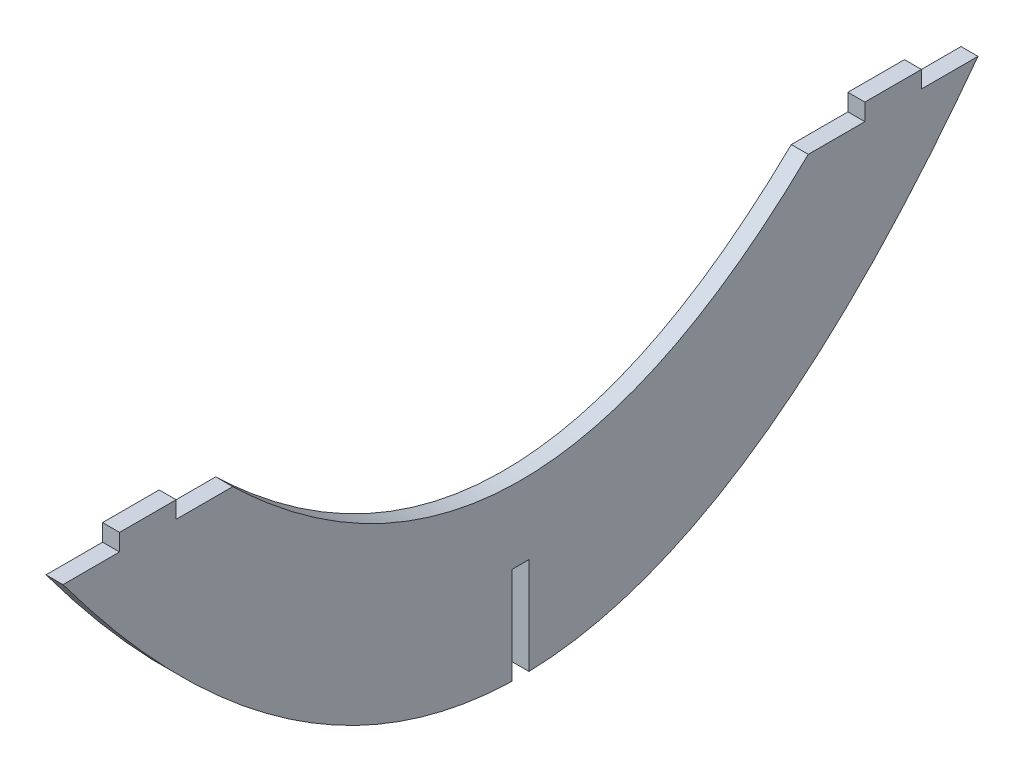
ISO-10303-21;
HEADER;
FILE_DESCRIPTION(('STEP AP214'),'2;1');
FILE_NAME('part.step','',(''),(''),'','','');
FILE_SCHEMA(('AUTOMOTIVE_DESIGN { 1 0 10303 214 1 1 1 1 }'));
ENDSEC;
DATA;
#1=APPLICATION_CONTEXT('core data for automotive mechanical design processes');
#2=APPLICATION_PROTOCOL_DEFINITION('international standard','automotive_design',2000,#1);
#3=PRODUCT_CONTEXT('',#1,'mechanical');
#4=PRODUCT('Part','Part','',(#3));
#5=PRODUCT_RELATED_PRODUCT_CATEGORY('part','',(#4));
#6=PRODUCT_DEFINITION_FORMATION('','',#4);
#7=PRODUCT_DEFINITION_CONTEXT('part definition',#1,'design');
#8=PRODUCT_DEFINITION('design','',#6,#7);
#9=PRODUCT_DEFINITION_SHAPE('','',#8);
#10=(LENGTH_UNIT() NAMED_UNIT(*) SI_UNIT(.MILLI.,.METRE.));
#11=(NAMED_UNIT(*) PLANE_ANGLE_UNIT() SI_UNIT($,.RADIAN.));
#12=(NAMED_UNIT(*) SI_UNIT($,.STERADIAN.) SOLID_ANGLE_UNIT());
#13=UNCERTAINTY_MEASURE_WITH_UNIT(LENGTH_MEASURE(1.E-05),#10,'distance_accuracy_value','');
#14=(GEOMETRIC_REPRESENTATION_CONTEXT(3) GLOBAL_UNCERTAINTY_ASSIGNED_CONTEXT((#13)) GLOBAL_UNIT_ASSIGNED_CONTEXT((#10,
#11,#12)) REPRESENTATION_CONTEXT('',''));
#15=CARTESIAN_POINT('',(0.,0.,0.));
#16=DIRECTION('',(0.,0.,1.));
#17=DIRECTION('',(1.,0.,0.));
#18=AXIS2_PLACEMENT_3D('',#15,#16,#17);
#19=CARTESIAN_POINT('',(3.,119.997819813928,80.8727741201523));
#20=CARTESIAN_POINT('',(3.,10.9954201860998,2.01496805352086E-11));
#21=CARTESIAN_POINT('',(3.,119.997819813872,-80.872774120112));
#22=B_SPLINE_CURVE_WITH_KNOTS('',2,(#19,#20,#21),.UNSPECIFIED.,.F.,.F.,(3,3),
(0.0624050077970689,0.937594992202713),.UNSPECIFIED.);
#23=DIRECTION('',(-1.,0.,0.));
#24=VECTOR('',#23,1.);
#25=SURFACE_OF_LINEAR_EXTRUSION('',#22,#24);
#26=DIRECTION('',(-1.,0.,0.));
#27=VECTOR('',#26,1.);
#28=CARTESIAN_POINT('',(3.,65.5153692500001,1.50000000000244));
#29=LINE('',#28,#27);
#30=CARTESIAN_POINT('',(3.,65.5153692500001,1.50000000000244));
#31=VERTEX_POINT('',#30);
#32=CARTESIAN_POINT('',(0.,65.5153692500001,1.50000000000244));
#33=VERTEX_POINT('',#32);
#34=EDGE_CURVE('E180',#31,#33,#29,.T.);
#35=ORIENTED_EDGE('',*,*,#34,.F.);
#36=CARTESIAN_POINT('',(3.,119.997819813902,80.8727741201333));
#37=VERTEX_POINT('',#36);
#38=EDGE_CURVE('E171',#37,#31,#22,.T.);
#39=ORIENTED_EDGE('',*,*,#38,.F.);
#40=DIRECTION('',(-1.,0.,0.));
#41=VECTOR('',#40,1.);
#42=CARTESIAN_POINT('',(3.,119.997819813902,80.8727741201333));
#43=LINE('',#42,#41);
#44=CARTESIAN_POINT('',(0.,119.997819813902,80.8727741201333));
#45=VERTEX_POINT('',#44);
#46=EDGE_CURVE('E46',#37,#45,#43,.T.);
#47=ORIENTED_EDGE('',*,*,#46,.T.);
#48=CARTESIAN_POINT('',(0.,119.997819813928,80.8727741201523));
#49=CARTESIAN_POINT('',(0.,10.9954201860998,2.01496805352086E-11));
#50=CARTESIAN_POINT('',(0.,119.997819813872,-80.872774120112));
#51=B_SPLINE_CURVE_WITH_KNOTS('',2,(#48,#49,#50),.UNSPECIFIED.,.F.,.F.,(3,3),
(0.0624050077970689,0.937594992202713),.UNSPECIFIED.);
#52=EDGE_CURVE('E291',#45,#33,#51,.T.);
#53=ORIENTED_EDGE('',*,*,#52,.T.);
#54=EDGE_LOOP('',(#35,#39,#47,#53));
#55=FACE_BOUND('',#54,.T.);
#56=ADVANCED_FACE('F37',(#55),#25,.F.);
#57=CARTESIAN_POINT('',(3.,95.49662,2.76688394418301E-11));
#58=DIRECTION('',(-1.,0.,0.));
#59=DIRECTION('',(0.,0.,1.));
#60=AXIS2_PLACEMENT_3D('',#57,#58,#59);
#61=PLANE('',#60);
#62=DIRECTION('',(0.,-1.,0.));
#63=VECTOR('',#62,1.);
#64=CARTESIAN_POINT('',(3.,0.,1.50000000000245));
#65=LINE('',#64,#63);
#66=CARTESIAN_POINT('',(3.,82.6427098007151,1.50000000000244));
#67=VERTEX_POINT('',#66);
#68=EDGE_CURVE('E163',#67,#31,#65,.T.);
#69=ORIENTED_EDGE('',*,*,#68,.F.);
#70=DIRECTION('',(0.,0.,1.));
#71=VECTOR('',#70,1.);
#72=CARTESIAN_POINT('',(3.,82.6427098007151,0.));
#73=LINE('',#72,#71);
#74=CARTESIAN_POINT('',(3.,82.6427098007151,-1.49999999999756));
#75=VERTEX_POINT('',#74);
#76=EDGE_CURVE('E152',#75,#67,#73,.T.);
#77=ORIENTED_EDGE('',*,*,#76,.F.);
#78=DIRECTION('',(0.,-1.,0.));
#79=VECTOR('',#78,1.);
#80=CARTESIAN_POINT('',(3.,0.,-1.49999999999756));
#81=LINE('',#80,#79);
#82=CARTESIAN_POINT('',(3.,65.5153692499999,-1.49999999999756));
#83=VERTEX_POINT('',#82);
#84=EDGE_CURVE('E162',#75,#83,#81,.T.);
#85=ORIENTED_EDGE('',*,*,#84,.T.);
#86=CARTESIAN_POINT('',(3.,119.997819813872,-80.872774120112));
#87=VERTEX_POINT('',#86);
#88=EDGE_CURVE('E251',#83,#87,#22,.T.);
#89=ORIENTED_EDGE('',*,*,#88,.T.);
#90=DIRECTION('',(0.,0.,1.));
#91=VECTOR('',#90,1.);
#92=CARTESIAN_POINT('',(3.,119.997819813902,-50.8705095800965));
#93=LINE('',#92,#91);
#94=CARTESIAN_POINT('',(3.,119.997819813902,-70.8716418501043));
#95=VERTEX_POINT('',#94);
#96=EDGE_CURVE('E257',#87,#95,#93,.T.);
#97=ORIENTED_EDGE('',*,*,#96,.T.);
#98=DIRECTION('',(0.,-1.,0.));
#99=VECTOR('',#98,1.);
#100=CARTESIAN_POINT('',(3.,122.997819813902,-70.8716418501043));
#101=LINE('',#100,#99);
#102=CARTESIAN_POINT('',(3.,122.997819813902,-70.8716418501043));
#103=VERTEX_POINT('',#102);
#104=EDGE_CURVE('E223',#103,#95,#101,.T.);
#105=ORIENTED_EDGE('',*,*,#104,.F.);
#106=DIRECTION('',(0.,0.,-1.));
#107=VECTOR('',#106,1.);
#108=CARTESIAN_POINT('',(3.,122.997819813902,0.));
#109=LINE('',#108,#107);
#110=CARTESIAN_POINT('',(3.,122.997819813902,-60.8716418501042));
#111=VERTEX_POINT('',#110);
#112=EDGE_CURVE('E221',#111,#103,#109,.T.);
#113=ORIENTED_EDGE('',*,*,#112,.F.);
#114=DIRECTION('',(0.,-1.,0.));
#115=VECTOR('',#114,1.);
#116=CARTESIAN_POINT('',(3.,122.997819813902,-60.8716418501042));
#117=LINE('',#116,#115);
#118=CARTESIAN_POINT('',(3.,119.997819813902,-60.8716418501042));
#119=VERTEX_POINT('',#118);
#120=EDGE_CURVE('E229',#111,#119,#117,.T.);
#121=ORIENTED_EDGE('',*,*,#120,.T.);
#122=CARTESIAN_POINT('',(3.,119.997819813902,-50.8705095800965));
#123=VERTEX_POINT('',#122);
#124=EDGE_CURVE('E256',#119,#123,#93,.T.);
#125=ORIENTED_EDGE('',*,*,#124,.T.);
#126=CARTESIAN_POINT('',(3.,119.997819813882,-50.8705095800754));
#127=CARTESIAN_POINT('',(3.,70.9954201860914,2.7670574165306E-11));
#128=CARTESIAN_POINT('',(3.,119.997819813935,50.8705095801307));
#129=B_SPLINE_CURVE_WITH_KNOTS('',2,(#126,#127,#128),.UNSPECIFIED.,.F.,.F.,(3,3),
(0.223373808690402,0.776626191309298),.UNSPECIFIED.);
#130=CARTESIAN_POINT('',(3.,119.997819813902,50.8705095800965));
#131=VERTEX_POINT('',#130);
#132=EDGE_CURVE('E238',#123,#131,#129,.T.);
#133=ORIENTED_EDGE('',*,*,#132,.T.);
#134=DIRECTION('',(0.,0.,1.));
#135=VECTOR('',#134,1.);
#136=CARTESIAN_POINT('',(3.,119.997819813902,80.8727741201333));
#137=LINE('',#136,#135);
#138=CARTESIAN_POINT('',(3.,119.997819813902,60.8716418501148));
#139=VERTEX_POINT('',#138);
#140=EDGE_CURVE('E245',#131,#139,#137,.T.);
#141=ORIENTED_EDGE('',*,*,#140,.T.);
#142=DIRECTION('',(0.,-1.,0.));
#143=VECTOR('',#142,1.);
#144=CARTESIAN_POINT('',(3.,122.997819813902,60.8716418501148));
#145=LINE('',#144,#143);
#146=CARTESIAN_POINT('',(3.,122.997819813902,60.8716418501148));
#147=VERTEX_POINT('',#146);
#148=EDGE_CURVE('E206',#147,#139,#145,.T.);
#149=ORIENTED_EDGE('',*,*,#148,.F.);
#150=DIRECTION('',(0.,0.,-1.));
#151=VECTOR('',#150,1.);
#152=CARTESIAN_POINT('',(3.,122.997819813902,0.));
#153=LINE('',#152,#151);
#154=CARTESIAN_POINT('',(3.,122.997819813902,70.8716418501149));
#155=VERTEX_POINT('',#154);
#156=EDGE_CURVE('E190',#155,#147,#153,.T.);
#157=ORIENTED_EDGE('',*,*,#156,.F.);
#158=DIRECTION('',(0.,-1.,0.));
#159=VECTOR('',#158,1.);
#160=CARTESIAN_POINT('',(3.,122.997819813902,70.8716418501149));
#161=LINE('',#160,#159);
#162=CARTESIAN_POINT('',(3.,119.997819813902,70.8716418501149));
#163=VERTEX_POINT('',#162);
#164=EDGE_CURVE('E209',#155,#163,#161,.T.);
#165=ORIENTED_EDGE('',*,*,#164,.T.);
#166=EDGE_CURVE('E61',#163,#37,#137,.T.);
#167=ORIENTED_EDGE('',*,*,#166,.T.);
#168=ORIENTED_EDGE('',*,*,#38,.T.);
#169=EDGE_LOOP('',(#69,#77,#85,#89,#97,#105,#113,#121,#125,#133,#141,#149,#157,#165,#167,#168));
#170=FACE_BOUND('',#169,.T.);
#171=ADVANCED_FACE('F169',(#170),#61,.F.);
#172=CARTESIAN_POINT('',(0.,95.49662,2.76688394418301E-11));
#173=DIRECTION('',(-1.,0.,0.));
#174=DIRECTION('',(0.,0.,1.));
#175=AXIS2_PLACEMENT_3D('',#172,#173,#174);
#176=PLANE('',#175);
#177=DIRECTION('',(0.,0.,1.));
#178=VECTOR('',#177,1.);
#179=CARTESIAN_POINT('',(0.,82.6427098007151,0.));
#180=LINE('',#179,#178);
#181=CARTESIAN_POINT('',(0.,82.6427098007151,-1.49999999999756));
#182=VERTEX_POINT('',#181);
#183=CARTESIAN_POINT('',(0.,82.6427098007151,1.50000000000244));
#184=VERTEX_POINT('',#183);
#185=EDGE_CURVE('E174',#182,#184,#180,.T.);
#186=ORIENTED_EDGE('',*,*,#185,.T.);
#187=DIRECTION('',(0.,-1.,0.));
#188=VECTOR('',#187,1.);
#189=CARTESIAN_POINT('',(0.,0.,1.50000000000245));
#190=LINE('',#189,#188);
#191=EDGE_CURVE('E53',#184,#33,#190,.T.);
#192=ORIENTED_EDGE('',*,*,#191,.T.);
#193=ORIENTED_EDGE('',*,*,#52,.F.);
#194=DIRECTION('',(0.,0.,1.));
#195=VECTOR('',#194,1.);
#196=CARTESIAN_POINT('',(0.,119.997819813902,80.8727741201333));
#197=LINE('',#196,#195);
#198=CARTESIAN_POINT('',(0.,119.997819813902,70.8716418501149));
#199=VERTEX_POINT('',#198);
#200=EDGE_CURVE('E345',#199,#45,#197,.T.);
#201=ORIENTED_EDGE('',*,*,#200,.F.);
#202=DIRECTION('',(0.,-1.,0.));
#203=VECTOR('',#202,1.);
#204=CARTESIAN_POINT('',(0.,122.997819813902,70.8716418501149));
#205=LINE('',#204,#203);
#206=CARTESIAN_POINT('',(0.,122.997819813902,70.8716418501149));
#207=VERTEX_POINT('',#206);
#208=EDGE_CURVE('E197',#207,#199,#205,.T.);
#209=ORIENTED_EDGE('',*,*,#208,.F.);
#210=DIRECTION('',(0.,0.,1.));
#211=VECTOR('',#210,1.);
#212=CARTESIAN_POINT('',(0.,122.997819813902,0.));
#213=LINE('',#212,#211);
#214=CARTESIAN_POINT('',(0.,122.997819813902,60.8716418501148));
#215=VERTEX_POINT('',#214);
#216=EDGE_CURVE('E195',#215,#207,#213,.T.);
#217=ORIENTED_EDGE('',*,*,#216,.F.);
#218=DIRECTION('',(0.,-1.,0.));
#219=VECTOR('',#218,1.);
#220=CARTESIAN_POINT('',(0.,122.997819813902,60.8716418501148));
#221=LINE('',#220,#219);
#222=CARTESIAN_POINT('',(0.,119.997819813902,60.8716418501148));
#223=VERTEX_POINT('',#222);
#224=EDGE_CURVE('E203',#215,#223,#221,.T.);
#225=ORIENTED_EDGE('',*,*,#224,.T.);
#226=CARTESIAN_POINT('',(0.,119.997819813902,50.8705095800965));
#227=VERTEX_POINT('',#226);
#228=EDGE_CURVE('E330',#227,#223,#197,.T.);
#229=ORIENTED_EDGE('',*,*,#228,.F.);
#230=CARTESIAN_POINT('',(0.,119.997819813882,-50.8705095800754));
#231=CARTESIAN_POINT('',(0.,70.9954201860914,2.7670574165306E-11));
#232=CARTESIAN_POINT('',(0.,119.997819813935,50.8705095801307));
#233=B_SPLINE_CURVE_WITH_KNOTS('',2,(#230,#231,#232),.UNSPECIFIED.,.F.,.F.,(3,3),
(0.223373808690402,0.776626191309298),.UNSPECIFIED.);
#234=CARTESIAN_POINT('',(0.,119.997819813902,-50.8705095800965));
#235=VERTEX_POINT('',#234);
#236=EDGE_CURVE('E237',#235,#227,#233,.T.);
#237=ORIENTED_EDGE('',*,*,#236,.F.);
#238=DIRECTION('',(0.,0.,1.));
#239=VECTOR('',#238,1.);
#240=CARTESIAN_POINT('',(0.,119.997819813902,-50.8705095800965));
#241=LINE('',#240,#239);
#242=CARTESIAN_POINT('',(0.,119.997819813902,-60.8716418501042));
#243=VERTEX_POINT('',#242);
#244=EDGE_CURVE('E318',#243,#235,#241,.T.);
#245=ORIENTED_EDGE('',*,*,#244,.F.);
#246=DIRECTION('',(0.,-1.,0.));
#247=VECTOR('',#246,1.);
#248=CARTESIAN_POINT('',(0.,122.997819813902,-60.8716418501042));
#249=LINE('',#248,#247);
#250=CARTESIAN_POINT('',(0.,122.997819813902,-60.8716418501042));
#251=VERTEX_POINT('',#250);
#252=EDGE_CURVE('E232',#251,#243,#249,.T.);
#253=ORIENTED_EDGE('',*,*,#252,.F.);
#254=DIRECTION('',(0.,0.,-1.));
#255=VECTOR('',#254,1.);
#256=CARTESIAN_POINT('',(0.,122.997819813902,0.));
#257=LINE('',#256,#255);
#258=CARTESIAN_POINT('',(0.,122.997819813902,-70.8716418501043));
#259=VERTEX_POINT('',#258);
#260=EDGE_CURVE('E215',#251,#259,#257,.T.);
#261=ORIENTED_EDGE('',*,*,#260,.T.);
#262=DIRECTION('',(0.,-1.,0.));
#263=VECTOR('',#262,1.);
#264=CARTESIAN_POINT('',(0.,122.997819813902,-70.8716418501043));
#265=LINE('',#264,#263);
#266=CARTESIAN_POINT('',(0.,119.997819813902,-70.8716418501043));
#267=VERTEX_POINT('',#266);
#268=EDGE_CURVE('E235',#259,#267,#265,.T.);
#269=ORIENTED_EDGE('',*,*,#268,.T.);
#270=CARTESIAN_POINT('',(0.,119.997819813872,-80.872774120112));
#271=VERTEX_POINT('',#270);
#272=EDGE_CURVE('E244',#271,#267,#241,.T.);
#273=ORIENTED_EDGE('',*,*,#272,.F.);
#274=CARTESIAN_POINT('',(0.,65.5153692499999,-1.49999999999756));
#275=VERTEX_POINT('',#274);
#276=EDGE_CURVE('E296',#275,#271,#51,.T.);
#277=ORIENTED_EDGE('',*,*,#276,.F.);
#278=DIRECTION('',(0.,-1.,0.));
#279=VECTOR('',#278,1.);
#280=CARTESIAN_POINT('',(0.,0.,-1.49999999999756));
#281=LINE('',#280,#279);
#282=EDGE_CURVE('E172',#182,#275,#281,.T.);
#283=ORIENTED_EDGE('',*,*,#282,.F.);
#284=EDGE_LOOP('',(#186,#192,#193,#201,#209,#217,#225,#229,#237,#245,#253,#261,#269,#273,#277,#283));
#285=FACE_BOUND('',#284,.T.);
#286=ADVANCED_FACE('F279',(#285),#176,.T.);
#287=CARTESIAN_POINT('',(3.,119.997819813902,80.8727741201333));
#288=DIRECTION('',(0.,-1.,0.));
#289=DIRECTION('',(0.,0.,-1.));
#290=AXIS2_PLACEMENT_3D('',#287,#288,#289);
#291=PLANE('',#290);
#292=DIRECTION('',(-1.,0.,0.));
#293=VECTOR('',#292,1.);
#294=CARTESIAN_POINT('',(0.,119.997819813902,60.8716418501148));
#295=LINE('',#294,#293);
#296=EDGE_CURVE('E191',#139,#223,#295,.T.);
#297=ORIENTED_EDGE('',*,*,#296,.F.);
#298=ORIENTED_EDGE('',*,*,#140,.F.);
#299=DIRECTION('',(-1.,0.,0.));
#300=VECTOR('',#299,1.);
#301=CARTESIAN_POINT('',(3.,119.997819813902,50.8705095800965));
#302=LINE('',#301,#300);
#303=EDGE_CURVE('E11',#131,#227,#302,.T.);
#304=ORIENTED_EDGE('',*,*,#303,.T.);
#305=ORIENTED_EDGE('',*,*,#228,.T.);
#306=EDGE_LOOP('',(#297,#298,#304,#305));
#307=FACE_BOUND('',#306,.T.);
#308=ADVANCED_FACE('F271',(#307),#291,.F.);
#309=CARTESIAN_POINT('',(3.,119.997819813902,-50.8705095800965));
#310=DIRECTION('',(0.,-1.,0.));
#311=DIRECTION('',(0.,0.,-1.));
#312=AXIS2_PLACEMENT_3D('',#309,#310,#311);
#313=PLANE('',#312);
#314=DIRECTION('',(1.,0.,0.));
#315=VECTOR('',#314,1.);
#316=CARTESIAN_POINT('',(0.,119.997819813902,-60.8716418501042));
#317=LINE('',#316,#315);
#318=EDGE_CURVE('E216',#243,#119,#317,.T.);
#319=ORIENTED_EDGE('',*,*,#318,.F.);
#320=ORIENTED_EDGE('',*,*,#244,.T.);
#321=DIRECTION('',(-1.,0.,0.));
#322=VECTOR('',#321,1.);
#323=CARTESIAN_POINT('',(3.,119.997819813902,-50.8705095800965));
#324=LINE('',#323,#322);
#325=EDGE_CURVE('E308',#123,#235,#324,.T.);
#326=ORIENTED_EDGE('',*,*,#325,.F.);
#327=ORIENTED_EDGE('',*,*,#124,.F.);
#328=EDGE_LOOP('',(#319,#320,#326,#327));
#329=FACE_BOUND('',#328,.T.);
#330=ADVANCED_FACE('F276',(#329),#313,.F.);
#331=DIRECTION('',(-1.,0.,0.));
#332=VECTOR('',#331,1.);
#333=SURFACE_OF_LINEAR_EXTRUSION('',#129,#332);
#334=ORIENTED_EDGE('',*,*,#236,.T.);
#335=ORIENTED_EDGE('',*,*,#303,.F.);
#336=ORIENTED_EDGE('',*,*,#132,.F.);
#337=ORIENTED_EDGE('',*,*,#325,.T.);
#338=EDGE_LOOP('',(#334,#335,#336,#337));
#339=FACE_BOUND('',#338,.T.);
#340=ADVANCED_FACE('F39',(#339),#333,.F.);
#341=ORIENTED_EDGE('',*,*,#166,.F.);
#342=DIRECTION('',(-1.,0.,0.));
#343=VECTOR('',#342,1.);
#344=CARTESIAN_POINT('',(0.,119.997819813902,70.8716418501149));
#345=LINE('',#344,#343);
#346=EDGE_CURVE('E182',#163,#199,#345,.T.);
#347=ORIENTED_EDGE('',*,*,#346,.T.);
#348=ORIENTED_EDGE('',*,*,#200,.T.);
#349=ORIENTED_EDGE('',*,*,#46,.F.);
#350=EDGE_LOOP('',(#341,#347,#348,#349));
#351=FACE_BOUND('',#350,.T.);
#352=ADVANCED_FACE('F267',(#351),#291,.F.);
#353=ORIENTED_EDGE('',*,*,#88,.F.);
#354=DIRECTION('',(-1.,0.,0.));
#355=VECTOR('',#354,1.);
#356=CARTESIAN_POINT('',(3.,65.5153692499999,-1.49999999999756));
#357=LINE('',#356,#355);
#358=EDGE_CURVE('E183',#83,#275,#357,.T.);
#359=ORIENTED_EDGE('',*,*,#358,.T.);
#360=ORIENTED_EDGE('',*,*,#276,.T.);
#361=DIRECTION('',(-1.,0.,0.));
#362=VECTOR('',#361,1.);
#363=CARTESIAN_POINT('',(3.,119.997819813872,-80.872774120112));
#364=LINE('',#363,#362);
#365=EDGE_CURVE('E302',#87,#271,#364,.T.);
#366=ORIENTED_EDGE('',*,*,#365,.F.);
#367=EDGE_LOOP('',(#353,#359,#360,#366));
#368=FACE_BOUND('',#367,.T.);
#369=ADVANCED_FACE('F263',(#368),#25,.F.);
#370=ORIENTED_EDGE('',*,*,#272,.T.);
#371=DIRECTION('',(1.,0.,0.));
#372=VECTOR('',#371,1.);
#373=CARTESIAN_POINT('',(0.,119.997819813902,-70.8716418501043));
#374=LINE('',#373,#372);
#375=EDGE_CURVE('E211',#267,#95,#374,.T.);
#376=ORIENTED_EDGE('',*,*,#375,.T.);
#377=ORIENTED_EDGE('',*,*,#96,.F.);
#378=ORIENTED_EDGE('',*,*,#365,.T.);
#379=EDGE_LOOP('',(#370,#376,#377,#378));
#380=FACE_BOUND('',#379,.T.);
#381=ADVANCED_FACE('F266',(#380),#313,.F.);
#382=CARTESIAN_POINT('',(0.,122.997819813902,-70.8716418501043));
#383=DIRECTION('',(0.,0.,-1.));
#384=DIRECTION('',(0.,1.,0.));
#385=AXIS2_PLACEMENT_3D('',#382,#383,#384);
#386=PLANE('',#385);
#387=ORIENTED_EDGE('',*,*,#375,.F.);
#388=ORIENTED_EDGE('',*,*,#268,.F.);
#389=DIRECTION('',(1.,0.,0.));
#390=VECTOR('',#389,1.);
#391=CARTESIAN_POINT('',(0.,122.997819813902,-70.8716418501043));
#392=LINE('',#391,#390);
#393=EDGE_CURVE('E212',#259,#103,#392,.T.);
#394=ORIENTED_EDGE('',*,*,#393,.T.);
#395=ORIENTED_EDGE('',*,*,#104,.T.);
#396=EDGE_LOOP('',(#387,#388,#394,#395));
#397=FACE_BOUND('',#396,.T.);
#398=ADVANCED_FACE('F311',(#397),#386,.T.);
#399=CARTESIAN_POINT('',(0.,122.997819813902,-60.8716418501042));
#400=DIRECTION('',(0.,0.,-1.));
#401=DIRECTION('',(0.,1.,0.));
#402=AXIS2_PLACEMENT_3D('',#399,#400,#401);
#403=PLANE('',#402);
#404=ORIENTED_EDGE('',*,*,#318,.T.);
#405=ORIENTED_EDGE('',*,*,#120,.F.);
#406=DIRECTION('',(1.,0.,0.));
#407=VECTOR('',#406,1.);
#408=CARTESIAN_POINT('',(0.,122.997819813902,-60.8716418501042));
#409=LINE('',#408,#407);
#410=EDGE_CURVE('E219',#251,#111,#409,.T.);
#411=ORIENTED_EDGE('',*,*,#410,.F.);
#412=ORIENTED_EDGE('',*,*,#252,.T.);
#413=EDGE_LOOP('',(#404,#405,#411,#412));
#414=FACE_BOUND('',#413,.T.);
#415=ADVANCED_FACE('F322',(#414),#403,.F.);
#416=CARTESIAN_POINT('',(0.,122.997819813902,0.));
#417=DIRECTION('',(0.,1.,0.));
#418=DIRECTION('',(0.,0.,1.));
#419=AXIS2_PLACEMENT_3D('',#416,#417,#418);
#420=PLANE('',#419);
#421=ORIENTED_EDGE('',*,*,#393,.F.);
#422=ORIENTED_EDGE('',*,*,#260,.F.);
#423=ORIENTED_EDGE('',*,*,#410,.T.);
#424=ORIENTED_EDGE('',*,*,#112,.T.);
#425=EDGE_LOOP('',(#421,#422,#423,#424));
#426=FACE_BOUND('',#425,.T.);
#427=ADVANCED_FACE('F315',(#426),#420,.T.);
#428=CARTESIAN_POINT('',(0.,122.997819813902,70.8716418501149));
#429=DIRECTION('',(0.,0.,1.));
#430=DIRECTION('',(0.,-1.,0.));
#431=AXIS2_PLACEMENT_3D('',#428,#429,#430);
#432=PLANE('',#431);
#433=ORIENTED_EDGE('',*,*,#346,.F.);
#434=ORIENTED_EDGE('',*,*,#164,.F.);
#435=DIRECTION('',(-1.,0.,0.));
#436=VECTOR('',#435,1.);
#437=CARTESIAN_POINT('',(0.,122.997819813902,70.8716418501149));
#438=LINE('',#437,#436);
#439=EDGE_CURVE('E187',#155,#207,#438,.T.);
#440=ORIENTED_EDGE('',*,*,#439,.T.);
#441=ORIENTED_EDGE('',*,*,#208,.T.);
#442=EDGE_LOOP('',(#433,#434,#440,#441));
#443=FACE_BOUND('',#442,.T.);
#444=ADVANCED_FACE('F344',(#443),#432,.T.);
#445=CARTESIAN_POINT('',(0.,122.997819813902,60.8716418501148));
#446=DIRECTION('',(0.,0.,1.));
#447=DIRECTION('',(0.,-1.,0.));
#448=AXIS2_PLACEMENT_3D('',#445,#446,#447);
#449=PLANE('',#448);
#450=ORIENTED_EDGE('',*,*,#296,.T.);
#451=ORIENTED_EDGE('',*,*,#224,.F.);
#452=DIRECTION('',(-1.,0.,0.));
#453=VECTOR('',#452,1.);
#454=CARTESIAN_POINT('',(0.,122.997819813902,60.8716418501148));
#455=LINE('',#454,#453);
#456=EDGE_CURVE('E193',#147,#215,#455,.T.);
#457=ORIENTED_EDGE('',*,*,#456,.F.);
#458=ORIENTED_EDGE('',*,*,#148,.T.);
#459=EDGE_LOOP('',(#450,#451,#457,#458));
#460=FACE_BOUND('',#459,.T.);
#461=ADVANCED_FACE('F335',(#460),#449,.F.);
#462=CARTESIAN_POINT('',(0.,122.997819813902,0.));
#463=DIRECTION('',(0.,1.,0.));
#464=DIRECTION('',(0.,0.,1.));
#465=AXIS2_PLACEMENT_3D('',#462,#463,#464);
#466=PLANE('',#465);
#467=ORIENTED_EDGE('',*,*,#439,.F.);
#468=ORIENTED_EDGE('',*,*,#156,.T.);
#469=ORIENTED_EDGE('',*,*,#456,.T.);
#470=ORIENTED_EDGE('',*,*,#216,.T.);
#471=EDGE_LOOP('',(#467,#468,#469,#470));
#472=FACE_BOUND('',#471,.T.);
#473=ADVANCED_FACE('F340',(#472),#466,.T.);
#474=CARTESIAN_POINT('',(3.,0.,1.50000000000245));
#475=DIRECTION('',(0.,0.,-1.));
#476=DIRECTION('',(0.,1.,0.));
#477=AXIS2_PLACEMENT_3D('',#474,#475,#476);
#478=PLANE('',#477);
#479=ORIENTED_EDGE('',*,*,#191,.F.);
#480=DIRECTION('',(-1.,0.,0.));
#481=VECTOR('',#480,1.);
#482=CARTESIAN_POINT('',(3.,82.6427098007151,1.50000000000244));
#483=LINE('',#482,#481);
#484=EDGE_CURVE('E155',#67,#184,#483,.T.);
#485=ORIENTED_EDGE('',*,*,#484,.F.);
#486=ORIENTED_EDGE('',*,*,#68,.T.);
#487=ORIENTED_EDGE('',*,*,#34,.T.);
#488=EDGE_LOOP('',(#479,#485,#486,#487));
#489=FACE_BOUND('',#488,.T.);
#490=ADVANCED_FACE('F165',(#489),#478,.T.);
#491=CARTESIAN_POINT('',(3.,0.,-1.49999999999756));
#492=DIRECTION('',(0.,0.,-1.));
#493=DIRECTION('',(-1.,0.,0.));
#494=AXIS2_PLACEMENT_3D('',#491,#492,#493);
#495=PLANE('',#494);
#496=ORIENTED_EDGE('',*,*,#282,.T.);
#497=ORIENTED_EDGE('',*,*,#358,.F.);
#498=ORIENTED_EDGE('',*,*,#84,.F.);
#499=DIRECTION('',(-1.,0.,0.));
#500=VECTOR('',#499,1.);
#501=CARTESIAN_POINT('',(3.,82.6427098007151,-1.49999999999756));
#502=LINE('',#501,#500);
#503=EDGE_CURVE('E157',#75,#182,#502,.T.);
#504=ORIENTED_EDGE('',*,*,#503,.T.);
#505=EDGE_LOOP('',(#496,#497,#498,#504));
#506=FACE_BOUND('',#505,.T.);
#507=ADVANCED_FACE('F298',(#506),#495,.F.);
#508=CARTESIAN_POINT('',(3.,82.6427098007151,0.));
#509=DIRECTION('',(0.,-1.,0.));
#510=DIRECTION('',(0.,0.,-1.));
#511=AXIS2_PLACEMENT_3D('',#508,#509,#510);
#512=PLANE('',#511);
#513=ORIENTED_EDGE('',*,*,#185,.F.);
#514=ORIENTED_EDGE('',*,*,#503,.F.);
#515=ORIENTED_EDGE('',*,*,#76,.T.);
#516=ORIENTED_EDGE('',*,*,#484,.T.);
#517=EDGE_LOOP('',(#513,#514,#515,#516));
#518=FACE_BOUND('',#517,.T.);
#519=ADVANCED_FACE('F154',(#518),#512,.T.);
#520=CLOSED_SHELL('',(#56,#171,#286,#308,#330,#340,#352,#369,#381,#398,#415,#427,#444,#461,#473,
#490,#507,#519));
#521=MANIFOLD_SOLID_BREP('B2',#520);
#522=ADVANCED_BREP_SHAPE_REPRESENTATION('',(#18,#521),#14);
#523=SHAPE_DEFINITION_REPRESENTATION(#9,#522);
ENDSEC;
END-ISO-10303-21;
